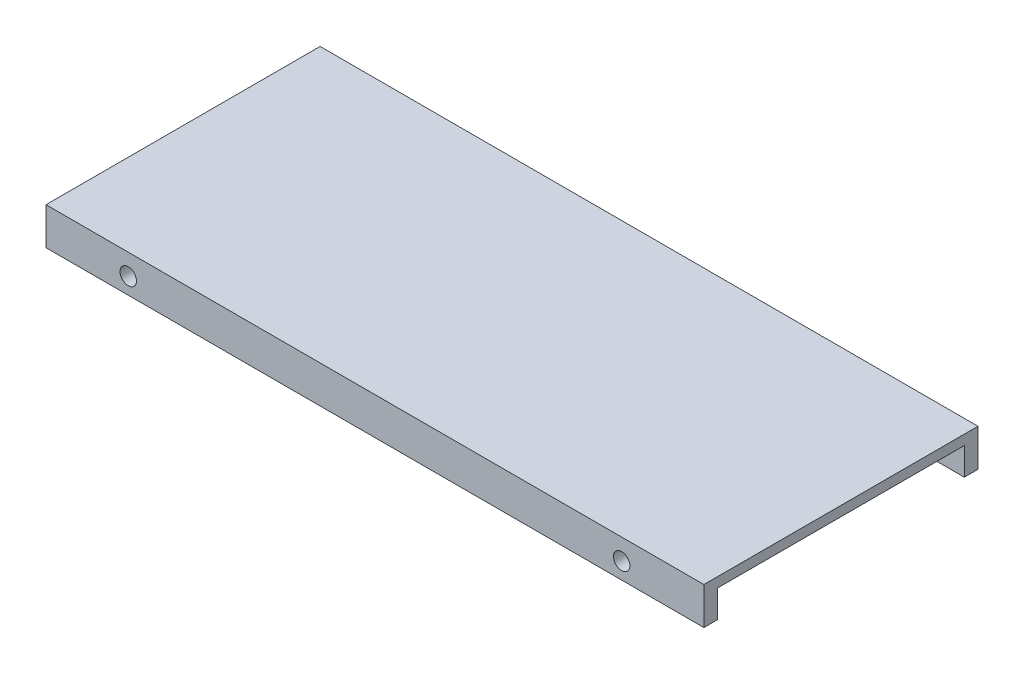
ISO-10303-21;
HEADER;
FILE_DESCRIPTION(('STEP AP214'),'2;1');
FILE_NAME('part.step','',(''),(''),'','','');
FILE_SCHEMA(('AUTOMOTIVE_DESIGN { 1 0 10303 214 1 1 1 1 }'));
ENDSEC;
DATA;
#1=APPLICATION_CONTEXT('core data for automotive mechanical design processes');
#2=APPLICATION_PROTOCOL_DEFINITION('international standard','automotive_design',2000,#1);
#3=PRODUCT_CONTEXT('',#1,'mechanical');
#4=PRODUCT('Part','Part','',(#3));
#5=PRODUCT_RELATED_PRODUCT_CATEGORY('part','',(#4));
#6=PRODUCT_DEFINITION_FORMATION('','',#4);
#7=PRODUCT_DEFINITION_CONTEXT('part definition',#1,'design');
#8=PRODUCT_DEFINITION('design','',#6,#7);
#9=PRODUCT_DEFINITION_SHAPE('','',#8);
#10=(LENGTH_UNIT() NAMED_UNIT(*) SI_UNIT(.MILLI.,.METRE.));
#11=(NAMED_UNIT(*) PLANE_ANGLE_UNIT() SI_UNIT($,.RADIAN.));
#12=(NAMED_UNIT(*) SI_UNIT($,.STERADIAN.) SOLID_ANGLE_UNIT());
#13=UNCERTAINTY_MEASURE_WITH_UNIT(LENGTH_MEASURE(1.E-05),#10,'distance_accuracy_value','');
#14=(GEOMETRIC_REPRESENTATION_CONTEXT(3) GLOBAL_UNCERTAINTY_ASSIGNED_CONTEXT((#13)) GLOBAL_UNIT_ASSIGNED_CONTEXT((#10,
#11,#12)) REPRESENTATION_CONTEXT('',''));
#15=CARTESIAN_POINT('',(0.,0.,0.));
#16=DIRECTION('',(0.,0.,1.));
#17=DIRECTION('',(1.,0.,0.));
#18=AXIS2_PLACEMENT_3D('',#15,#16,#17);
#19=CARTESIAN_POINT('',(0.,0.,0.));
#20=DIRECTION('',(0.,-1.,0.));
#21=DIRECTION('',(0.,0.,-1.));
#22=AXIS2_PLACEMENT_3D('',#19,#20,#21);
#23=PLANE('',#22);
#24=DIRECTION('',(-1.,0.,0.));
#25=VECTOR('',#24,1.);
#26=CARTESIAN_POINT('',(0.,0.,-25.));
#27=LINE('',#26,#25);
#28=CARTESIAN_POINT('',(1200.,0.,-25.));
#29=VERTEX_POINT('',#28);
#30=CARTESIAN_POINT('',(0.,0.,-25.));
#31=VERTEX_POINT('',#30);
#32=EDGE_CURVE('E134',#29,#31,#27,.T.);
#33=ORIENTED_EDGE('',*,*,#32,.F.);
#34=DIRECTION('',(0.,0.,-1.));
#35=VECTOR('',#34,1.);
#36=CARTESIAN_POINT('',(1200.,0.,0.));
#37=LINE('',#36,#35);
#38=CARTESIAN_POINT('',(1200.,0.,0.));
#39=VERTEX_POINT('',#38);
#40=EDGE_CURVE('E191',#39,#29,#37,.T.);
#41=ORIENTED_EDGE('',*,*,#40,.F.);
#42=DIRECTION('',(1.,0.,0.));
#43=VECTOR('',#42,1.);
#44=CARTESIAN_POINT('',(0.,0.,0.));
#45=LINE('',#44,#43);
#46=CARTESIAN_POINT('',(0.,0.,0.));
#47=VERTEX_POINT('',#46);
#48=EDGE_CURVE('E187',#47,#39,#45,.T.);
#49=ORIENTED_EDGE('',*,*,#48,.F.);
#50=DIRECTION('',(0.,0.,1.));
#51=VECTOR('',#50,1.);
#52=CARTESIAN_POINT('',(0.,0.,0.));
#53=LINE('',#52,#51);
#54=EDGE_CURVE('E170',#31,#47,#53,.T.);
#55=ORIENTED_EDGE('',*,*,#54,.F.);
#56=EDGE_LOOP('',(#33,#41,#49,#55));
#57=FACE_BOUND('',#56,.T.);
#58=ADVANCED_FACE('F39',(#57),#23,.T.);
#59=CARTESIAN_POINT('',(150.,30.,-500.));
#60=DIRECTION('',(0.,0.,1.));
#61=DIRECTION('',(1.,0.,0.));
#62=AXIS2_PLACEMENT_3D('',#59,#60,#61);
#63=CYLINDRICAL_SURFACE('',#62,15.);
#64=CARTESIAN_POINT('',(150.,30.,-25.));
#65=DIRECTION('',(0.,0.,1.));
#66=DIRECTION('',(1.,0.,0.));
#67=AXIS2_PLACEMENT_3D('',#64,#65,#66);
#68=CIRCLE('',#67,15.);
#69=CARTESIAN_POINT('',(165.,30.,-25.));
#70=VERTEX_POINT('',#69);
#71=EDGE_CURVE('E153',#70,#70,#68,.F.);
#72=ORIENTED_EDGE('',*,*,#71,.T.);
#73=EDGE_LOOP('',(#72));
#74=FACE_BOUND('',#73,.T.);
#75=CARTESIAN_POINT('',(150.,30.,0.));
#76=DIRECTION('',(0.,0.,1.));
#77=DIRECTION('',(1.,0.,0.));
#78=AXIS2_PLACEMENT_3D('',#75,#76,#77);
#79=CIRCLE('',#78,15.);
#80=CARTESIAN_POINT('',(165.,30.,0.));
#81=VERTEX_POINT('',#80);
#82=EDGE_CURVE('E162',#81,#81,#79,.T.);
#83=ORIENTED_EDGE('',*,*,#82,.T.);
#84=EDGE_LOOP('',(#83));
#85=FACE_BOUND('',#84,.T.);
#86=ADVANCED_FACE('F253',(#74,#85),#63,.F.);
#87=CARTESIAN_POINT('',(1050.,30.,0.));
#88=DIRECTION('',(0.,0.,-1.));
#89=DIRECTION('',(-1.,0.,0.));
#90=AXIS2_PLACEMENT_3D('',#87,#88,#89);
#91=CYLINDRICAL_SURFACE('',#90,14.9999999999999);
#92=CARTESIAN_POINT('',(1050.,30.,-25.));
#93=DIRECTION('',(0.,0.,1.));
#94=DIRECTION('',(1.,0.,0.));
#95=AXIS2_PLACEMENT_3D('',#92,#93,#94);
#96=CIRCLE('',#95,14.9999999999999);
#97=CARTESIAN_POINT('',(1065.,30.,-25.));
#98=VERTEX_POINT('',#97);
#99=EDGE_CURVE('E43',#98,#98,#96,.F.);
#100=ORIENTED_EDGE('',*,*,#99,.T.);
#101=EDGE_LOOP('',(#100));
#102=FACE_BOUND('',#101,.T.);
#103=CARTESIAN_POINT('',(1050.,30.,0.));
#104=DIRECTION('',(0.,0.,-1.));
#105=DIRECTION('',(-1.,0.,0.));
#106=AXIS2_PLACEMENT_3D('',#103,#104,#105);
#107=CIRCLE('',#106,14.9999999999999);
#108=CARTESIAN_POINT('',(1035.,30.,0.));
#109=VERTEX_POINT('',#108);
#110=EDGE_CURVE('E158',#109,#109,#107,.T.);
#111=ORIENTED_EDGE('',*,*,#110,.F.);
#112=EDGE_LOOP('',(#111));
#113=FACE_BOUND('',#112,.T.);
#114=ADVANCED_FACE('F237',(#102,#113),#91,.F.);
#115=CARTESIAN_POINT('',(0.,68.,0.));
#116=DIRECTION('',(1.,0.,0.));
#117=DIRECTION('',(0.,0.,-1.));
#118=AXIS2_PLACEMENT_3D('',#115,#116,#117);
#119=PLANE('',#118);
#120=DIRECTION('',(0.,0.,-1.));
#121=VECTOR('',#120,1.);
#122=CARTESIAN_POINT('',(0.,50.,-25.));
#123=LINE('',#122,#121);
#124=CARTESIAN_POINT('',(0.,50.,-25.));
#125=VERTEX_POINT('',#124);
#126=CARTESIAN_POINT('',(0.,50.,-475.));
#127=VERTEX_POINT('',#126);
#128=EDGE_CURVE('E124',#125,#127,#123,.T.);
#129=ORIENTED_EDGE('',*,*,#128,.F.);
#130=DIRECTION('',(0.,-1.,0.));
#131=VECTOR('',#130,1.);
#132=CARTESIAN_POINT('',(0.,50.,-25.));
#133=LINE('',#132,#131);
#134=EDGE_CURVE('E206',#125,#31,#133,.T.);
#135=ORIENTED_EDGE('',*,*,#134,.T.);
#136=ORIENTED_EDGE('',*,*,#54,.T.);
#137=DIRECTION('',(0.,-1.,0.));
#138=VECTOR('',#137,1.);
#139=CARTESIAN_POINT('',(0.,68.,0.));
#140=LINE('',#139,#138);
#141=CARTESIAN_POINT('',(0.,68.,0.));
#142=VERTEX_POINT('',#141);
#143=EDGE_CURVE('E11',#142,#47,#140,.T.);
#144=ORIENTED_EDGE('',*,*,#143,.F.);
#145=DIRECTION('',(0.,0.,1.));
#146=VECTOR('',#145,1.);
#147=CARTESIAN_POINT('',(0.,68.,0.));
#148=LINE('',#147,#146);
#149=CARTESIAN_POINT('',(0.,68.,-500.));
#150=VERTEX_POINT('',#149);
#151=EDGE_CURVE('E174',#150,#142,#148,.T.);
#152=ORIENTED_EDGE('',*,*,#151,.F.);
#153=DIRECTION('',(0.,-1.,0.));
#154=VECTOR('',#153,1.);
#155=CARTESIAN_POINT('',(0.,68.,-500.));
#156=LINE('',#155,#154);
#157=CARTESIAN_POINT('',(0.,0.,-500.));
#158=VERTEX_POINT('',#157);
#159=EDGE_CURVE('E184',#150,#158,#156,.T.);
#160=ORIENTED_EDGE('',*,*,#159,.T.);
#161=CARTESIAN_POINT('',(0.,0.,-475.));
#162=VERTEX_POINT('',#161);
#163=EDGE_CURVE('E138',#158,#162,#53,.T.);
#164=ORIENTED_EDGE('',*,*,#163,.T.);
#165=DIRECTION('',(0.,-1.,0.));
#166=VECTOR('',#165,1.);
#167=CARTESIAN_POINT('',(0.,50.,-475.));
#168=LINE('',#167,#166);
#169=EDGE_CURVE('E57',#127,#162,#168,.T.);
#170=ORIENTED_EDGE('',*,*,#169,.F.);
#171=EDGE_LOOP('',(#129,#135,#136,#144,#152,#160,#164,#170));
#172=FACE_BOUND('',#171,.T.);
#173=ADVANCED_FACE('F41',(#172),#119,.F.);
#174=CARTESIAN_POINT('',(0.,68.,0.));
#175=DIRECTION('',(0.,0.,-1.));
#176=DIRECTION('',(-1.,0.,0.));
#177=AXIS2_PLACEMENT_3D('',#174,#175,#176);
#178=PLANE('',#177);
#179=ORIENTED_EDGE('',*,*,#110,.T.);
#180=EDGE_LOOP('',(#179));
#181=FACE_BOUND('',#180,.T.);
#182=ORIENTED_EDGE('',*,*,#82,.F.);
#183=EDGE_LOOP('',(#182));
#184=FACE_BOUND('',#183,.T.);
#185=ORIENTED_EDGE('',*,*,#48,.T.);
#186=DIRECTION('',(0.,-1.,0.));
#187=VECTOR('',#186,1.);
#188=CARTESIAN_POINT('',(1200.,68.,0.));
#189=LINE('',#188,#187);
#190=CARTESIAN_POINT('',(1200.,68.,0.));
#191=VERTEX_POINT('',#190);
#192=EDGE_CURVE('E49',#191,#39,#189,.T.);
#193=ORIENTED_EDGE('',*,*,#192,.F.);
#194=DIRECTION('',(1.,0.,0.));
#195=VECTOR('',#194,1.);
#196=CARTESIAN_POINT('',(0.,68.,0.));
#197=LINE('',#196,#195);
#198=EDGE_CURVE('E94',#142,#191,#197,.T.);
#199=ORIENTED_EDGE('',*,*,#198,.F.);
#200=ORIENTED_EDGE('',*,*,#143,.T.);
#201=EDGE_LOOP('',(#185,#193,#199,#200));
#202=FACE_BOUND('',#201,.T.);
#203=ADVANCED_FACE('F276',(#181,#184,#202),#178,.F.);
#204=CARTESIAN_POINT('',(1200.,68.,0.));
#205=DIRECTION('',(-1.,0.,0.));
#206=DIRECTION('',(0.,0.,1.));
#207=AXIS2_PLACEMENT_3D('',#204,#205,#206);
#208=PLANE('',#207);
#209=ORIENTED_EDGE('',*,*,#40,.T.);
#210=DIRECTION('',(0.,-1.,0.));
#211=VECTOR('',#210,1.);
#212=CARTESIAN_POINT('',(1200.,50.,-25.));
#213=LINE('',#212,#211);
#214=CARTESIAN_POINT('',(1200.,50.,-25.));
#215=VERTEX_POINT('',#214);
#216=EDGE_CURVE('E143',#215,#29,#213,.T.);
#217=ORIENTED_EDGE('',*,*,#216,.F.);
#218=DIRECTION('',(0.,0.,1.));
#219=VECTOR('',#218,1.);
#220=CARTESIAN_POINT('',(1200.,50.,-25.));
#221=LINE('',#220,#219);
#222=CARTESIAN_POINT('',(1200.,50.,-475.));
#223=VERTEX_POINT('',#222);
#224=EDGE_CURVE('E123',#223,#215,#221,.T.);
#225=ORIENTED_EDGE('',*,*,#224,.F.);
#226=DIRECTION('',(0.,-1.,0.));
#227=VECTOR('',#226,1.);
#228=CARTESIAN_POINT('',(1200.,50.,-475.));
#229=LINE('',#228,#227);
#230=CARTESIAN_POINT('',(1200.,0.,-475.));
#231=VERTEX_POINT('',#230);
#232=EDGE_CURVE('E119',#223,#231,#229,.T.);
#233=ORIENTED_EDGE('',*,*,#232,.T.);
#234=CARTESIAN_POINT('',(1200.,0.,-500.));
#235=VERTEX_POINT('',#234);
#236=EDGE_CURVE('E190',#231,#235,#37,.T.);
#237=ORIENTED_EDGE('',*,*,#236,.T.);
#238=DIRECTION('',(0.,-1.,0.));
#239=VECTOR('',#238,1.);
#240=CARTESIAN_POINT('',(1200.,68.,-500.));
#241=LINE('',#240,#239);
#242=CARTESIAN_POINT('',(1200.,68.,-500.));
#243=VERTEX_POINT('',#242);
#244=EDGE_CURVE('E199',#243,#235,#241,.T.);
#245=ORIENTED_EDGE('',*,*,#244,.F.);
#246=DIRECTION('',(0.,0.,-1.));
#247=VECTOR('',#246,1.);
#248=CARTESIAN_POINT('',(1200.,68.,0.));
#249=LINE('',#248,#247);
#250=EDGE_CURVE('E179',#191,#243,#249,.T.);
#251=ORIENTED_EDGE('',*,*,#250,.F.);
#252=ORIENTED_EDGE('',*,*,#192,.T.);
#253=EDGE_LOOP('',(#209,#217,#225,#233,#237,#245,#251,#252));
#254=FACE_BOUND('',#253,.T.);
#255=ADVANCED_FACE('F226',(#254),#208,.F.);
#256=CARTESIAN_POINT('',(0.,68.,-500.));
#257=DIRECTION('',(0.,0.,1.));
#258=DIRECTION('',(1.,0.,0.));
#259=AXIS2_PLACEMENT_3D('',#256,#257,#258);
#260=PLANE('',#259);
#261=CARTESIAN_POINT('',(1050.,30.,-500.));
#262=DIRECTION('',(0.,0.,-1.));
#263=DIRECTION('',(-1.,0.,0.));
#264=AXIS2_PLACEMENT_3D('',#261,#262,#263);
#265=CIRCLE('',#264,14.9999999999999);
#266=CARTESIAN_POINT('',(1035.,30.,-500.));
#267=VERTEX_POINT('',#266);
#268=EDGE_CURVE('E157',#267,#267,#265,.T.);
#269=ORIENTED_EDGE('',*,*,#268,.F.);
#270=EDGE_LOOP('',(#269));
#271=FACE_BOUND('',#270,.T.);
#272=CARTESIAN_POINT('',(150.,30.,-500.));
#273=DIRECTION('',(0.,0.,1.));
#274=DIRECTION('',(1.,0.,0.));
#275=AXIS2_PLACEMENT_3D('',#272,#273,#274);
#276=CIRCLE('',#275,15.);
#277=CARTESIAN_POINT('',(165.,30.,-500.));
#278=VERTEX_POINT('',#277);
#279=EDGE_CURVE('E166',#278,#278,#276,.T.);
#280=ORIENTED_EDGE('',*,*,#279,.T.);
#281=EDGE_LOOP('',(#280));
#282=FACE_BOUND('',#281,.T.);
#283=DIRECTION('',(-1.,0.,0.));
#284=VECTOR('',#283,1.);
#285=CARTESIAN_POINT('',(0.,0.,-500.));
#286=LINE('',#285,#284);
#287=EDGE_CURVE('E87',#235,#158,#286,.T.);
#288=ORIENTED_EDGE('',*,*,#287,.T.);
#289=ORIENTED_EDGE('',*,*,#159,.F.);
#290=DIRECTION('',(-1.,0.,0.));
#291=VECTOR('',#290,1.);
#292=CARTESIAN_POINT('',(0.,68.,-500.));
#293=LINE('',#292,#291);
#294=EDGE_CURVE('E66',#243,#150,#293,.T.);
#295=ORIENTED_EDGE('',*,*,#294,.F.);
#296=ORIENTED_EDGE('',*,*,#244,.T.);
#297=EDGE_LOOP('',(#288,#289,#295,#296));
#298=FACE_BOUND('',#297,.T.);
#299=ADVANCED_FACE('F271',(#271,#282,#298),#260,.F.);
#300=CARTESIAN_POINT('',(0.,68.,0.));
#301=DIRECTION('',(0.,-1.,0.));
#302=DIRECTION('',(0.,0.,-1.));
#303=AXIS2_PLACEMENT_3D('',#300,#301,#302);
#304=PLANE('',#303);
#305=ORIENTED_EDGE('',*,*,#151,.T.);
#306=ORIENTED_EDGE('',*,*,#198,.T.);
#307=ORIENTED_EDGE('',*,*,#250,.T.);
#308=ORIENTED_EDGE('',*,*,#294,.T.);
#309=EDGE_LOOP('',(#305,#306,#307,#308));
#310=FACE_BOUND('',#309,.T.);
#311=ADVANCED_FACE('F264',(#310),#304,.F.);
#312=DIRECTION('',(1.,0.,0.));
#313=VECTOR('',#312,1.);
#314=CARTESIAN_POINT('',(0.,0.,-475.));
#315=LINE('',#314,#313);
#316=EDGE_CURVE('E216',#162,#231,#315,.T.);
#317=ORIENTED_EDGE('',*,*,#316,.F.);
#318=ORIENTED_EDGE('',*,*,#163,.F.);
#319=ORIENTED_EDGE('',*,*,#287,.F.);
#320=ORIENTED_EDGE('',*,*,#236,.F.);
#321=EDGE_LOOP('',(#317,#318,#319,#320));
#322=FACE_BOUND('',#321,.T.);
#323=ADVANCED_FACE('F255',(#322),#23,.T.);
#324=CARTESIAN_POINT('',(150.,30.,-475.));
#325=DIRECTION('',(0.,0.,-1.));
#326=DIRECTION('',(-1.,0.,0.));
#327=AXIS2_PLACEMENT_3D('',#324,#325,#326);
#328=CIRCLE('',#327,15.);
#329=CARTESIAN_POINT('',(135.,30.,-475.));
#330=VERTEX_POINT('',#329);
#331=EDGE_CURVE('E148',#330,#330,#328,.F.);
#332=ORIENTED_EDGE('',*,*,#331,.T.);
#333=EDGE_LOOP('',(#332));
#334=FACE_BOUND('',#333,.T.);
#335=ORIENTED_EDGE('',*,*,#279,.F.);
#336=EDGE_LOOP('',(#335));
#337=FACE_BOUND('',#336,.T.);
#338=ADVANCED_FACE('F249',(#334,#337),#63,.F.);
#339=CARTESIAN_POINT('',(1050.,30.,-475.));
#340=DIRECTION('',(0.,0.,-1.));
#341=DIRECTION('',(-1.,0.,0.));
#342=AXIS2_PLACEMENT_3D('',#339,#340,#341);
#343=CIRCLE('',#342,14.9999999999999);
#344=CARTESIAN_POINT('',(1035.,30.,-475.));
#345=VERTEX_POINT('',#344);
#346=EDGE_CURVE('E152',#345,#345,#343,.F.);
#347=ORIENTED_EDGE('',*,*,#346,.T.);
#348=EDGE_LOOP('',(#347));
#349=FACE_BOUND('',#348,.T.);
#350=ORIENTED_EDGE('',*,*,#268,.T.);
#351=EDGE_LOOP('',(#350));
#352=FACE_BOUND('',#351,.T.);
#353=ADVANCED_FACE('F241',(#349,#352),#91,.F.);
#354=CARTESIAN_POINT('',(0.,50.,-25.));
#355=DIRECTION('',(0.,0.,1.));
#356=DIRECTION('',(1.,0.,0.));
#357=AXIS2_PLACEMENT_3D('',#354,#355,#356);
#358=PLANE('',#357);
#359=ORIENTED_EDGE('',*,*,#99,.F.);
#360=EDGE_LOOP('',(#359));
#361=FACE_BOUND('',#360,.T.);
#362=ORIENTED_EDGE('',*,*,#32,.T.);
#363=ORIENTED_EDGE('',*,*,#134,.F.);
#364=DIRECTION('',(-1.,0.,0.));
#365=VECTOR('',#364,1.);
#366=CARTESIAN_POINT('',(0.,50.,-25.));
#367=LINE('',#366,#365);
#368=EDGE_CURVE('E130',#215,#125,#367,.T.);
#369=ORIENTED_EDGE('',*,*,#368,.F.);
#370=ORIENTED_EDGE('',*,*,#216,.T.);
#371=EDGE_LOOP('',(#362,#363,#369,#370));
#372=FACE_BOUND('',#371,.T.);
#373=ORIENTED_EDGE('',*,*,#71,.F.);
#374=EDGE_LOOP('',(#373));
#375=FACE_BOUND('',#374,.T.);
#376=ADVANCED_FACE('F223',(#361,#372,#375),#358,.F.);
#377=CARTESIAN_POINT('',(0.,50.,-475.));
#378=DIRECTION('',(0.,0.,-1.));
#379=DIRECTION('',(-1.,0.,0.));
#380=AXIS2_PLACEMENT_3D('',#377,#378,#379);
#381=PLANE('',#380);
#382=ORIENTED_EDGE('',*,*,#346,.F.);
#383=EDGE_LOOP('',(#382));
#384=FACE_BOUND('',#383,.T.);
#385=ORIENTED_EDGE('',*,*,#316,.T.);
#386=ORIENTED_EDGE('',*,*,#232,.F.);
#387=DIRECTION('',(1.,0.,0.));
#388=VECTOR('',#387,1.);
#389=CARTESIAN_POINT('',(0.,50.,-475.));
#390=LINE('',#389,#388);
#391=EDGE_CURVE('E114',#127,#223,#390,.T.);
#392=ORIENTED_EDGE('',*,*,#391,.F.);
#393=ORIENTED_EDGE('',*,*,#169,.T.);
#394=EDGE_LOOP('',(#385,#386,#392,#393));
#395=FACE_BOUND('',#394,.T.);
#396=ORIENTED_EDGE('',*,*,#331,.F.);
#397=EDGE_LOOP('',(#396));
#398=FACE_BOUND('',#397,.T.);
#399=ADVANCED_FACE('F116',(#384,#395,#398),#381,.F.);
#400=CARTESIAN_POINT('',(0.,50.,0.));
#401=DIRECTION('',(0.,-1.,0.));
#402=DIRECTION('',(0.,0.,-1.));
#403=AXIS2_PLACEMENT_3D('',#400,#401,#402);
#404=PLANE('',#403);
#405=ORIENTED_EDGE('',*,*,#128,.T.);
#406=ORIENTED_EDGE('',*,*,#391,.T.);
#407=ORIENTED_EDGE('',*,*,#224,.T.);
#408=ORIENTED_EDGE('',*,*,#368,.T.);
#409=EDGE_LOOP('',(#405,#406,#407,#408));
#410=FACE_BOUND('',#409,.T.);
#411=ADVANCED_FACE('F128',(#410),#404,.T.);
#412=CLOSED_SHELL('',(#58,#86,#114,#173,#203,#255,#299,#311,#323,#338,#353,#376,#399,#411));
#413=MANIFOLD_SOLID_BREP('B2',#412);
#414=ADVANCED_BREP_SHAPE_REPRESENTATION('',(#18,#413),#14);
#415=SHAPE_DEFINITION_REPRESENTATION(#9,#414);
ENDSEC;
END-ISO-10303-21;
